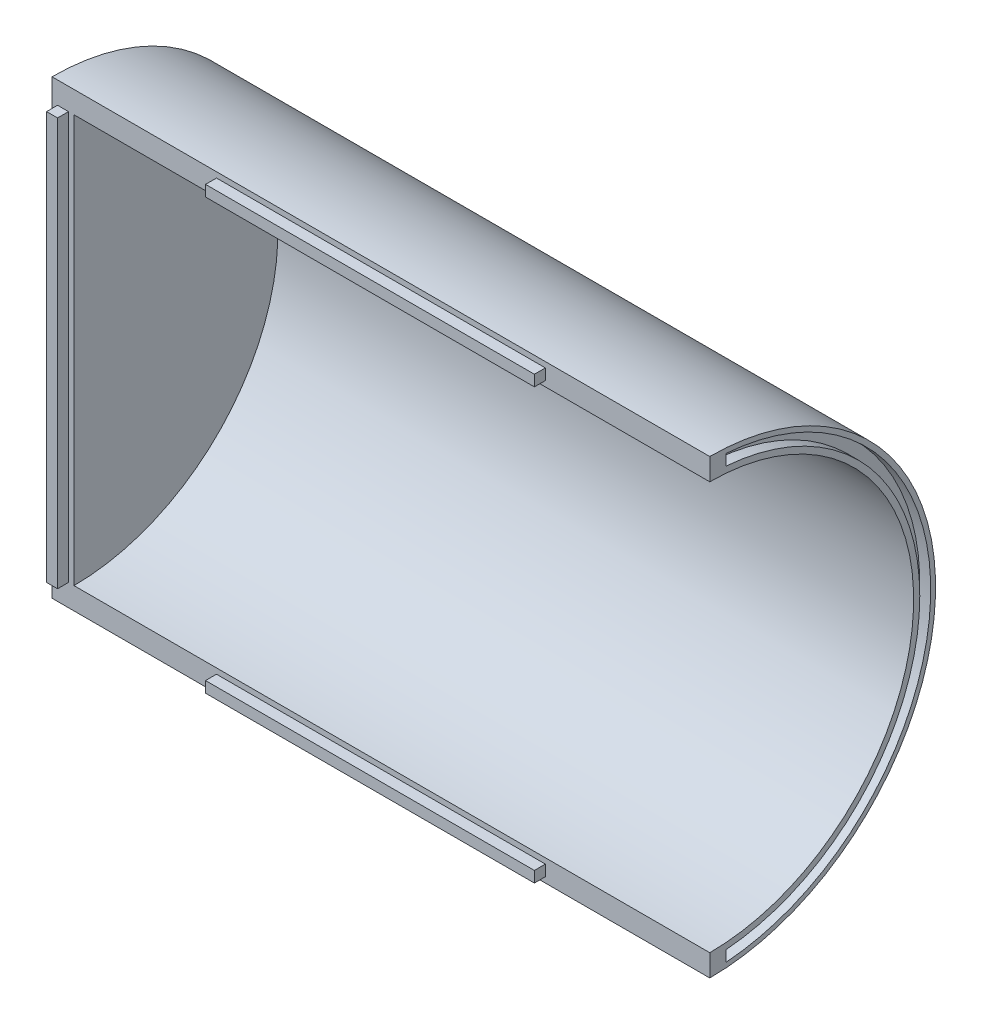
ISO-10303-21;
HEADER;
FILE_DESCRIPTION(('STEP AP214'),'2;1');
FILE_NAME('part.step','',(''),(''),'','','');
FILE_SCHEMA(('AUTOMOTIVE_DESIGN { 1 0 10303 214 1 1 1 1 }'));
ENDSEC;
DATA;
#1=APPLICATION_CONTEXT('core data for automotive mechanical design processes');
#2=APPLICATION_PROTOCOL_DEFINITION('international standard','automotive_design',2000,#1);
#3=PRODUCT_CONTEXT('',#1,'mechanical');
#4=PRODUCT('Part','Part','',(#3));
#5=PRODUCT_RELATED_PRODUCT_CATEGORY('part','',(#4));
#6=PRODUCT_DEFINITION_FORMATION('','',#4);
#7=PRODUCT_DEFINITION_CONTEXT('part definition',#1,'design');
#8=PRODUCT_DEFINITION('design','',#6,#7);
#9=PRODUCT_DEFINITION_SHAPE('','',#8);
#10=(LENGTH_UNIT() NAMED_UNIT(*) SI_UNIT(.MILLI.,.METRE.));
#11=(NAMED_UNIT(*) PLANE_ANGLE_UNIT() SI_UNIT($,.RADIAN.));
#12=(NAMED_UNIT(*) SI_UNIT($,.STERADIAN.) SOLID_ANGLE_UNIT());
#13=UNCERTAINTY_MEASURE_WITH_UNIT(LENGTH_MEASURE(1.E-05),#10,'distance_accuracy_value','');
#14=(GEOMETRIC_REPRESENTATION_CONTEXT(3) GLOBAL_UNCERTAINTY_ASSIGNED_CONTEXT((#13)) GLOBAL_UNIT_ASSIGNED_CONTEXT((#10,
#11,#12)) REPRESENTATION_CONTEXT('',''));
#15=CARTESIAN_POINT('',(0.,0.,0.));
#16=DIRECTION('',(0.,0.,1.));
#17=DIRECTION('',(1.,0.,0.));
#18=AXIS2_PLACEMENT_3D('',#15,#16,#17);
#19=CARTESIAN_POINT('',(152.4,-52.324,3.65376539147256E-13));
#20=DIRECTION('',(1.,0.,0.));
#21=DIRECTION('',(0.,1.,0.));
#22=AXIS2_PLACEMENT_3D('',#19,#20,#21);
#23=PLANE('',#22);
#24=CARTESIAN_POINT('',(152.4,0.,0.));
#25=DIRECTION('',(1.,0.,0.));
#26=DIRECTION('',(0.,1.,0.));
#27=AXIS2_PLACEMENT_3D('',#24,#25,#26);
#28=CIRCLE('',#27,47.244);
#29=CARTESIAN_POINT('',(152.4,-47.244,3.2990308874461E-13));
#30=VERTEX_POINT('',#29);
#31=CARTESIAN_POINT('',(152.4,47.244,0.));
#32=VERTEX_POINT('',#31);
#33=EDGE_CURVE('E372',#30,#32,#28,.T.);
#34=ORIENTED_EDGE('',*,*,#33,.F.);
#35=DIRECTION('',(0.,-1.,0.));
#36=VECTOR('',#35,1.);
#37=CARTESIAN_POINT('',(152.4,-52.324,3.65376539147256E-13));
#38=LINE('',#37,#36);
#39=CARTESIAN_POINT('',(152.4,-52.324,3.65376539147256E-13));
#40=VERTEX_POINT('',#39);
#41=EDGE_CURVE('E357',#30,#40,#38,.T.);
#42=ORIENTED_EDGE('',*,*,#41,.T.);
#43=CARTESIAN_POINT('',(152.4,0.,0.));
#44=DIRECTION('',(1.,0.,0.));
#45=DIRECTION('',(0.,1.,0.));
#46=AXIS2_PLACEMENT_3D('',#43,#44,#45);
#47=CIRCLE('',#46,52.324);
#48=CARTESIAN_POINT('',(152.4,52.324,0.));
#49=VERTEX_POINT('',#48);
#50=EDGE_CURVE('E48',#40,#49,#47,.T.);
#51=ORIENTED_EDGE('',*,*,#50,.T.);
#52=DIRECTION('',(0.,1.,0.));
#53=VECTOR('',#52,1.);
#54=CARTESIAN_POINT('',(152.4,52.324,0.));
#55=LINE('',#54,#53);
#56=EDGE_CURVE('E341',#32,#49,#55,.T.);
#57=ORIENTED_EDGE('',*,*,#56,.F.);
#58=EDGE_LOOP('',(#34,#42,#51,#57));
#59=FACE_BOUND('',#58,.T.);
#60=CARTESIAN_POINT('',(152.4,0.,0.));
#61=DIRECTION('',(1.,0.,0.));
#62=DIRECTION('',(0.,1.,0.));
#63=AXIS2_PLACEMENT_3D('',#60,#61,#62);
#64=CIRCLE('',#63,51.1959667942701);
#65=CARTESIAN_POINT('',(152.4,-51.054,-3.81000000000033));
#66=VERTEX_POINT('',#65);
#67=CARTESIAN_POINT('',(152.4,51.054,-3.81000000000037));
#68=VERTEX_POINT('',#67);
#69=EDGE_CURVE('E197',#66,#68,#64,.T.);
#70=ORIENTED_EDGE('',*,*,#69,.F.);
#71=DIRECTION('',(0.,1.,0.));
#72=VECTOR('',#71,1.);
#73=CARTESIAN_POINT('',(152.4,-51.054,-3.81000000000034));
#74=LINE('',#73,#72);
#75=CARTESIAN_POINT('',(152.4,-48.514,-3.81000000000034));
#76=VERTEX_POINT('',#75);
#77=EDGE_CURVE('E55',#66,#76,#74,.T.);
#78=ORIENTED_EDGE('',*,*,#77,.T.);
#79=CARTESIAN_POINT('',(152.4,0.,0.));
#80=DIRECTION('',(1.,0.,0.));
#81=DIRECTION('',(0.,1.,0.));
#82=AXIS2_PLACEMENT_3D('',#79,#80,#81);
#83=CIRCLE('',#82,48.66337735916);
#84=CARTESIAN_POINT('',(152.4,48.514,-3.81000000000034));
#85=VERTEX_POINT('',#84);
#86=EDGE_CURVE('E201',#76,#85,#83,.T.);
#87=ORIENTED_EDGE('',*,*,#86,.T.);
#88=DIRECTION('',(0.,-1.,0.));
#89=VECTOR('',#88,1.);
#90=CARTESIAN_POINT('',(152.4,51.054,-3.81000000000034));
#91=LINE('',#90,#89);
#92=EDGE_CURVE('E626',#68,#85,#91,.T.);
#93=ORIENTED_EDGE('',*,*,#92,.F.);
#94=EDGE_LOOP('',(#70,#78,#87,#93));
#95=FACE_BOUND('',#94,.T.);
#96=ADVANCED_FACE('F39',(#59,#95),#23,.T.);
#97=CARTESIAN_POINT('',(0.,0.,0.));
#98=DIRECTION('',(0.,0.,1.));
#99=DIRECTION('',(-1.,0.,0.));
#100=AXIS2_PLACEMENT_3D('',#97,#98,#99);
#101=PLANE('',#100);
#102=DIRECTION('',(1.,0.,0.));
#103=VECTOR('',#102,1.);
#104=CARTESIAN_POINT('',(38.1,51.0540000000002,0.));
#105=LINE('',#104,#103);
#106=CARTESIAN_POINT('',(38.1,51.0540000000002,0.));
#107=VERTEX_POINT('',#106);
#108=CARTESIAN_POINT('',(114.3,51.0539999999998,0.));
#109=VERTEX_POINT('',#108);
#110=EDGE_CURVE('E233',#107,#109,#105,.T.);
#111=ORIENTED_EDGE('',*,*,#110,.T.);
#112=DIRECTION('',(0.,1.,0.));
#113=VECTOR('',#112,1.);
#114=CARTESIAN_POINT('',(114.3,48.5140000000002,0.));
#115=LINE('',#114,#113);
#116=CARTESIAN_POINT('',(114.3,48.5140000000002,-3.38771451345273E-13));
#117=VERTEX_POINT('',#116);
#118=EDGE_CURVE('E230',#117,#109,#115,.T.);
#119=ORIENTED_EDGE('',*,*,#118,.F.);
#120=DIRECTION('',(1.,0.,0.));
#121=VECTOR('',#120,1.);
#122=CARTESIAN_POINT('',(38.1,48.5140000000002,0.));
#123=LINE('',#122,#121);
#124=CARTESIAN_POINT('',(38.1,48.5140000000002,0.));
#125=VERTEX_POINT('',#124);
#126=EDGE_CURVE('E226',#125,#117,#123,.T.);
#127=ORIENTED_EDGE('',*,*,#126,.F.);
#128=DIRECTION('',(0.,1.,0.));
#129=VECTOR('',#128,1.);
#130=CARTESIAN_POINT('',(38.1,48.5140000000002,0.));
#131=LINE('',#130,#129);
#132=EDGE_CURVE('E222',#125,#107,#131,.T.);
#133=ORIENTED_EDGE('',*,*,#132,.T.);
#134=EDGE_LOOP('',(#111,#119,#127,#133));
#135=FACE_BOUND('',#134,.T.);
#136=DIRECTION('',(0.,-1.,0.));
#137=VECTOR('',#136,1.);
#138=CARTESIAN_POINT('',(5.08,-47.244,3.2990308874461E-13));
#139=LINE('',#138,#137);
#140=CARTESIAN_POINT('',(5.08,47.244,0.));
#141=VERTEX_POINT('',#140);
#142=CARTESIAN_POINT('',(5.08,-47.244,3.2990308874461E-13));
#143=VERTEX_POINT('',#142);
#144=EDGE_CURVE('E349',#141,#143,#139,.T.);
#145=ORIENTED_EDGE('',*,*,#144,.F.);
#146=DIRECTION('',(1.,0.,0.));
#147=VECTOR('',#146,1.);
#148=CARTESIAN_POINT('',(152.4,47.244,0.));
#149=LINE('',#148,#147);
#150=EDGE_CURVE('E337',#141,#32,#149,.T.);
#151=ORIENTED_EDGE('',*,*,#150,.T.);
#152=ORIENTED_EDGE('',*,*,#56,.T.);
#153=DIRECTION('',(-1.,0.,0.));
#154=VECTOR('',#153,1.);
#155=CARTESIAN_POINT('',(0.,52.324,0.));
#156=LINE('',#155,#154);
#157=CARTESIAN_POINT('',(0.,52.324,0.));
#158=VERTEX_POINT('',#157);
#159=EDGE_CURVE('E345',#49,#158,#156,.T.);
#160=ORIENTED_EDGE('',*,*,#159,.T.);
#161=DIRECTION('',(0.,1.,0.));
#162=VECTOR('',#161,1.);
#163=CARTESIAN_POINT('',(0.,0.,0.));
#164=LINE('',#163,#162);
#165=CARTESIAN_POINT('',(0.,-52.324,3.65376539147256E-13));
#166=VERTEX_POINT('',#165);
#167=EDGE_CURVE('E365',#166,#158,#164,.T.);
#168=ORIENTED_EDGE('',*,*,#167,.F.);
#169=DIRECTION('',(-1.,0.,0.));
#170=VECTOR('',#169,1.);
#171=CARTESIAN_POINT('',(0.,-52.324,3.65376539147256E-13));
#172=LINE('',#171,#170);
#173=EDGE_CURVE('E361',#40,#166,#172,.T.);
#174=ORIENTED_EDGE('',*,*,#173,.F.);
#175=ORIENTED_EDGE('',*,*,#41,.F.);
#176=DIRECTION('',(1.,0.,0.));
#177=VECTOR('',#176,1.);
#178=CARTESIAN_POINT('',(152.4,-47.244,3.2990308874461E-13));
#179=LINE('',#178,#177);
#180=EDGE_CURVE('E353',#143,#30,#179,.T.);
#181=ORIENTED_EDGE('',*,*,#180,.F.);
#182=EDGE_LOOP('',(#145,#151,#152,#160,#168,#174,#175,#181));
#183=FACE_BOUND('',#182,.T.);
#184=DIRECTION('',(1.,0.,0.));
#185=VECTOR('',#184,1.);
#186=CARTESIAN_POINT('',(38.1,-51.0539999999998,0.));
#187=LINE('',#186,#185);
#188=CARTESIAN_POINT('',(38.1,-51.0539999999998,3.56508176546594E-13));
#189=VERTEX_POINT('',#188);
#190=CARTESIAN_POINT('',(114.3,-51.0539999999998,3.56508176546594E-13));
#191=VERTEX_POINT('',#190);
#192=EDGE_CURVE('E313',#189,#191,#187,.T.);
#193=ORIENTED_EDGE('',*,*,#192,.F.);
#194=DIRECTION('',(0.,-1.,0.));
#195=VECTOR('',#194,1.);
#196=CARTESIAN_POINT('',(38.1,-48.5140000000002,0.));
#197=LINE('',#196,#195);
#198=CARTESIAN_POINT('',(38.1,-48.5140000000002,0.));
#199=VERTEX_POINT('',#198);
#200=EDGE_CURVE('E280',#199,#189,#197,.T.);
#201=ORIENTED_EDGE('',*,*,#200,.F.);
#202=DIRECTION('',(1.,0.,0.));
#203=VECTOR('',#202,1.);
#204=CARTESIAN_POINT('',(38.1,-48.5140000000002,0.));
#205=LINE('',#204,#203);
#206=CARTESIAN_POINT('',(114.3,-48.5140000000002,3.38771451345273E-13));
#207=VERTEX_POINT('',#206);
#208=EDGE_CURVE('E298',#199,#207,#205,.T.);
#209=ORIENTED_EDGE('',*,*,#208,.T.);
#210=DIRECTION('',(0.,-1.,0.));
#211=VECTOR('',#210,1.);
#212=CARTESIAN_POINT('',(114.3,-48.5140000000002,0.));
#213=LINE('',#212,#211);
#214=EDGE_CURVE('E317',#207,#191,#213,.T.);
#215=ORIENTED_EDGE('',*,*,#214,.T.);
#216=EDGE_LOOP('',(#193,#201,#209,#215));
#217=FACE_BOUND('',#216,.T.);
#218=DIRECTION('',(0.,1.,0.));
#219=VECTOR('',#218,1.);
#220=CARTESIAN_POINT('',(1.26999999999995,-47.244,0.));
#221=LINE('',#220,#219);
#222=CARTESIAN_POINT('',(1.26999999999995,-47.244,0.));
#223=VERTEX_POINT('',#222);
#224=CARTESIAN_POINT('',(1.26999999999997,47.244,0.));
#225=VERTEX_POINT('',#224);
#226=EDGE_CURVE('E272',#223,#225,#221,.T.);
#227=ORIENTED_EDGE('',*,*,#226,.T.);
#228=DIRECTION('',(-1.,0.,0.));
#229=VECTOR('',#228,1.);
#230=CARTESIAN_POINT('',(3.80999999999997,47.244,0.));
#231=LINE('',#230,#229);
#232=CARTESIAN_POINT('',(3.80999999999997,47.244,0.));
#233=VERTEX_POINT('',#232);
#234=EDGE_CURVE('E276',#233,#225,#231,.T.);
#235=ORIENTED_EDGE('',*,*,#234,.F.);
#236=DIRECTION('',(0.,1.,0.));
#237=VECTOR('',#236,1.);
#238=CARTESIAN_POINT('',(3.81000000000005,-47.244,0.));
#239=LINE('',#238,#237);
#240=CARTESIAN_POINT('',(3.81000000000005,-47.244,3.2990308874461E-13));
#241=VERTEX_POINT('',#240);
#242=EDGE_CURVE('E264',#241,#233,#239,.T.);
#243=ORIENTED_EDGE('',*,*,#242,.F.);
#244=DIRECTION('',(-1.,0.,0.));
#245=VECTOR('',#244,1.);
#246=CARTESIAN_POINT('',(3.81000000000005,-47.244,0.));
#247=LINE('',#246,#245);
#248=EDGE_CURVE('E267',#241,#223,#247,.T.);
#249=ORIENTED_EDGE('',*,*,#248,.T.);
#250=EDGE_LOOP('',(#227,#235,#243,#249));
#251=FACE_BOUND('',#250,.T.);
#252=ADVANCED_FACE('F383',(#135,#183,#217,#251),#101,.T.);
#253=CARTESIAN_POINT('',(0.,0.,0.));
#254=DIRECTION('',(-1.,0.,0.));
#255=DIRECTION('',(0.,-1.,0.));
#256=AXIS2_PLACEMENT_3D('',#253,#254,#255);
#257=PLANE('',#256);
#258=CARTESIAN_POINT('',(0.,0.,0.));
#259=DIRECTION('',(1.,0.,0.));
#260=DIRECTION('',(0.,1.,0.));
#261=AXIS2_PLACEMENT_3D('',#258,#259,#260);
#262=CIRCLE('',#261,52.324);
#263=EDGE_CURVE('E11',#166,#158,#262,.T.);
#264=ORIENTED_EDGE('',*,*,#263,.F.);
#265=ORIENTED_EDGE('',*,*,#167,.T.);
#266=EDGE_LOOP('',(#264,#265));
#267=FACE_BOUND('',#266,.T.);
#268=ADVANCED_FACE('F41',(#267),#257,.T.);
#269=CARTESIAN_POINT('',(5.08,0.,0.));
#270=DIRECTION('',(1.,0.,0.));
#271=DIRECTION('',(0.,1.,0.));
#272=AXIS2_PLACEMENT_3D('',#269,#270,#271);
#273=CYLINDRICAL_SURFACE('',#272,52.324);
#274=ORIENTED_EDGE('',*,*,#50,.F.);
#275=ORIENTED_EDGE('',*,*,#173,.T.);
#276=ORIENTED_EDGE('',*,*,#263,.T.);
#277=ORIENTED_EDGE('',*,*,#159,.F.);
#278=EDGE_LOOP('',(#274,#275,#276,#277));
#279=FACE_BOUND('',#278,.T.);
#280=ADVANCED_FACE('F387',(#279),#273,.T.);
#281=CARTESIAN_POINT('',(5.08,0.,0.));
#282=DIRECTION('',(1.,0.,0.));
#283=DIRECTION('',(0.,1.,0.));
#284=AXIS2_PLACEMENT_3D('',#281,#282,#283);
#285=CYLINDRICAL_SURFACE('',#284,47.244);
#286=CARTESIAN_POINT('',(5.08,0.,0.));
#287=DIRECTION('',(1.,0.,0.));
#288=DIRECTION('',(0.,1.,0.));
#289=AXIS2_PLACEMENT_3D('',#286,#287,#288);
#290=CIRCLE('',#289,47.244);
#291=EDGE_CURVE('E368',#143,#141,#290,.T.);
#292=ORIENTED_EDGE('',*,*,#291,.F.);
#293=ORIENTED_EDGE('',*,*,#180,.T.);
#294=ORIENTED_EDGE('',*,*,#33,.T.);
#295=ORIENTED_EDGE('',*,*,#150,.F.);
#296=EDGE_LOOP('',(#292,#293,#294,#295));
#297=FACE_BOUND('',#296,.T.);
#298=ADVANCED_FACE('F391',(#297),#285,.F.);
#299=CARTESIAN_POINT('',(5.08,-47.244,3.2990308874461E-13));
#300=DIRECTION('',(1.,0.,0.));
#301=DIRECTION('',(0.,1.,0.));
#302=AXIS2_PLACEMENT_3D('',#299,#300,#301);
#303=PLANE('',#302);
#304=ORIENTED_EDGE('',*,*,#144,.T.);
#305=ORIENTED_EDGE('',*,*,#291,.T.);
#306=EDGE_LOOP('',(#304,#305));
#307=FACE_BOUND('',#306,.T.);
#308=ADVANCED_FACE('F393',(#307),#303,.T.);
#309=CARTESIAN_POINT('',(38.1,-48.5140000000002,2.54));
#310=DIRECTION('',(1.,0.,0.));
#311=DIRECTION('',(0.,1.,0.));
#312=AXIS2_PLACEMENT_3D('',#309,#310,#311);
#313=PLANE('',#312);
#314=ORIENTED_EDGE('',*,*,#200,.T.);
#315=DIRECTION('',(0.,0.,-1.));
#316=VECTOR('',#315,1.);
#317=CARTESIAN_POINT('',(38.1,-51.0539999999998,2.54));
#318=LINE('',#317,#316);
#319=CARTESIAN_POINT('',(38.1,-51.0539999999998,2.54));
#320=VERTEX_POINT('',#319);
#321=EDGE_CURVE('E333',#320,#189,#318,.T.);
#322=ORIENTED_EDGE('',*,*,#321,.F.);
#323=DIRECTION('',(0.,-1.,0.));
#324=VECTOR('',#323,1.);
#325=CARTESIAN_POINT('',(38.1,-48.5140000000002,2.54));
#326=LINE('',#325,#324);
#327=CARTESIAN_POINT('',(38.1,-48.5140000000002,2.54));
#328=VERTEX_POINT('',#327);
#329=EDGE_CURVE('E293',#328,#320,#326,.T.);
#330=ORIENTED_EDGE('',*,*,#329,.F.);
#331=DIRECTION('',(0.,0.,-1.));
#332=VECTOR('',#331,1.);
#333=CARTESIAN_POINT('',(38.1,-48.5140000000002,2.54));
#334=LINE('',#333,#332);
#335=EDGE_CURVE('E309',#328,#199,#334,.T.);
#336=ORIENTED_EDGE('',*,*,#335,.T.);
#337=EDGE_LOOP('',(#314,#322,#330,#336));
#338=FACE_BOUND('',#337,.T.);
#339=ADVANCED_FACE('F395',(#338),#313,.F.);
#340=CARTESIAN_POINT('',(38.1,-51.0539999999998,2.54));
#341=DIRECTION('',(0.,1.,0.));
#342=DIRECTION('',(0.,0.,1.));
#343=AXIS2_PLACEMENT_3D('',#340,#341,#342);
#344=PLANE('',#343);
#345=ORIENTED_EDGE('',*,*,#192,.T.);
#346=DIRECTION('',(0.,0.,-1.));
#347=VECTOR('',#346,1.);
#348=CARTESIAN_POINT('',(114.3,-51.0539999999998,2.54));
#349=LINE('',#348,#347);
#350=CARTESIAN_POINT('',(114.3,-51.0539999999998,2.54));
#351=VERTEX_POINT('',#350);
#352=EDGE_CURVE('E329',#351,#191,#349,.T.);
#353=ORIENTED_EDGE('',*,*,#352,.F.);
#354=DIRECTION('',(1.,0.,0.));
#355=VECTOR('',#354,1.);
#356=CARTESIAN_POINT('',(38.1,-51.0539999999998,2.54));
#357=LINE('',#356,#355);
#358=EDGE_CURVE('E297',#320,#351,#357,.T.);
#359=ORIENTED_EDGE('',*,*,#358,.F.);
#360=ORIENTED_EDGE('',*,*,#321,.T.);
#361=EDGE_LOOP('',(#345,#353,#359,#360));
#362=FACE_BOUND('',#361,.T.);
#363=ADVANCED_FACE('F401',(#362),#344,.F.);
#364=CARTESIAN_POINT('',(114.3,-48.5140000000002,2.54));
#365=DIRECTION('',(1.,0.,0.));
#366=DIRECTION('',(0.,1.,0.));
#367=AXIS2_PLACEMENT_3D('',#364,#365,#366);
#368=PLANE('',#367);
#369=ORIENTED_EDGE('',*,*,#214,.F.);
#370=DIRECTION('',(0.,0.,-1.));
#371=VECTOR('',#370,1.);
#372=CARTESIAN_POINT('',(114.3,-48.5140000000002,2.54));
#373=LINE('',#372,#371);
#374=CARTESIAN_POINT('',(114.3,-48.5140000000002,2.54));
#375=VERTEX_POINT('',#374);
#376=EDGE_CURVE('E325',#375,#207,#373,.T.);
#377=ORIENTED_EDGE('',*,*,#376,.F.);
#378=DIRECTION('',(0.,-1.,0.));
#379=VECTOR('',#378,1.);
#380=CARTESIAN_POINT('',(114.3,-48.5140000000002,2.54));
#381=LINE('',#380,#379);
#382=EDGE_CURVE('E301',#375,#351,#381,.T.);
#383=ORIENTED_EDGE('',*,*,#382,.T.);
#384=ORIENTED_EDGE('',*,*,#352,.T.);
#385=EDGE_LOOP('',(#369,#377,#383,#384));
#386=FACE_BOUND('',#385,.T.);
#387=ADVANCED_FACE('F441',(#386),#368,.T.);
#388=CARTESIAN_POINT('',(38.1,-48.5140000000002,2.54));
#389=DIRECTION('',(0.,1.,0.));
#390=DIRECTION('',(0.,0.,1.));
#391=AXIS2_PLACEMENT_3D('',#388,#389,#390);
#392=PLANE('',#391);
#393=ORIENTED_EDGE('',*,*,#208,.F.);
#394=ORIENTED_EDGE('',*,*,#335,.F.);
#395=DIRECTION('',(1.,0.,0.));
#396=VECTOR('',#395,1.);
#397=CARTESIAN_POINT('',(38.1,-48.5140000000002,2.54));
#398=LINE('',#397,#396);
#399=EDGE_CURVE('E305',#328,#375,#398,.T.);
#400=ORIENTED_EDGE('',*,*,#399,.T.);
#401=ORIENTED_EDGE('',*,*,#376,.T.);
#402=EDGE_LOOP('',(#393,#394,#400,#401));
#403=FACE_BOUND('',#402,.T.);
#404=ADVANCED_FACE('F451',(#403),#392,.T.);
#405=CARTESIAN_POINT('',(0.,0.,2.54));
#406=DIRECTION('',(0.,0.,1.));
#407=DIRECTION('',(1.,0.,0.));
#408=AXIS2_PLACEMENT_3D('',#405,#406,#407);
#409=PLANE('',#408);
#410=ORIENTED_EDGE('',*,*,#329,.T.);
#411=ORIENTED_EDGE('',*,*,#358,.T.);
#412=ORIENTED_EDGE('',*,*,#382,.F.);
#413=ORIENTED_EDGE('',*,*,#399,.F.);
#414=EDGE_LOOP('',(#410,#411,#412,#413));
#415=FACE_BOUND('',#414,.T.);
#416=ADVANCED_FACE('F461',(#415),#409,.T.);
#417=CARTESIAN_POINT('',(3.80999999999997,47.244,2.54));
#418=DIRECTION('',(0.,-1.,0.));
#419=DIRECTION('',(0.,0.,-1.));
#420=AXIS2_PLACEMENT_3D('',#417,#418,#419);
#421=PLANE('',#420);
#422=ORIENTED_EDGE('',*,*,#234,.T.);
#423=DIRECTION('',(0.,0.,-1.));
#424=VECTOR('',#423,1.);
#425=CARTESIAN_POINT('',(1.26999999999997,47.244,2.54));
#426=LINE('',#425,#424);
#427=CARTESIAN_POINT('',(1.26999999999997,47.244,2.54));
#428=VERTEX_POINT('',#427);
#429=EDGE_CURVE('E237',#428,#225,#426,.T.);
#430=ORIENTED_EDGE('',*,*,#429,.F.);
#431=DIRECTION('',(-1.,0.,0.));
#432=VECTOR('',#431,1.);
#433=CARTESIAN_POINT('',(3.80999999999997,47.244,2.54));
#434=LINE('',#433,#432);
#435=CARTESIAN_POINT('',(3.80999999999997,47.244,2.54));
#436=VERTEX_POINT('',#435);
#437=EDGE_CURVE('E268',#436,#428,#434,.T.);
#438=ORIENTED_EDGE('',*,*,#437,.F.);
#439=DIRECTION('',(0.,0.,-1.));
#440=VECTOR('',#439,1.);
#441=CARTESIAN_POINT('',(3.80999999999997,47.244,2.54));
#442=LINE('',#441,#440);
#443=EDGE_CURVE('E259',#436,#233,#442,.T.);
#444=ORIENTED_EDGE('',*,*,#443,.T.);
#445=EDGE_LOOP('',(#422,#430,#438,#444));
#446=FACE_BOUND('',#445,.T.);
#447=ADVANCED_FACE('F471',(#446),#421,.F.);
#448=CARTESIAN_POINT('',(1.26999999999995,-47.244,2.54));
#449=DIRECTION('',(-1.,0.,0.));
#450=DIRECTION('',(0.,-1.,0.));
#451=AXIS2_PLACEMENT_3D('',#448,#449,#450);
#452=PLANE('',#451);
#453=ORIENTED_EDGE('',*,*,#226,.F.);
#454=DIRECTION('',(0.,0.,-1.));
#455=VECTOR('',#454,1.);
#456=CARTESIAN_POINT('',(1.26999999999995,-47.244,2.54));
#457=LINE('',#456,#455);
#458=CARTESIAN_POINT('',(1.26999999999995,-47.244,2.54));
#459=VERTEX_POINT('',#458);
#460=EDGE_CURVE('E252',#459,#223,#457,.T.);
#461=ORIENTED_EDGE('',*,*,#460,.F.);
#462=DIRECTION('',(0.,1.,0.));
#463=VECTOR('',#462,1.);
#464=CARTESIAN_POINT('',(1.26999999999995,-47.244,2.54));
#465=LINE('',#464,#463);
#466=EDGE_CURVE('E287',#459,#428,#465,.T.);
#467=ORIENTED_EDGE('',*,*,#466,.T.);
#468=ORIENTED_EDGE('',*,*,#429,.T.);
#469=EDGE_LOOP('',(#453,#461,#467,#468));
#470=FACE_BOUND('',#469,.T.);
#471=ADVANCED_FACE('F481',(#470),#452,.T.);
#472=CARTESIAN_POINT('',(3.81000000000005,-47.244,2.54));
#473=DIRECTION('',(0.,-1.,0.));
#474=DIRECTION('',(0.,0.,-1.));
#475=AXIS2_PLACEMENT_3D('',#472,#473,#474);
#476=PLANE('',#475);
#477=ORIENTED_EDGE('',*,*,#248,.F.);
#478=DIRECTION('',(0.,0.,-1.));
#479=VECTOR('',#478,1.);
#480=CARTESIAN_POINT('',(3.81000000000005,-47.244,2.54));
#481=LINE('',#480,#479);
#482=CARTESIAN_POINT('',(3.81000000000005,-47.244,2.54));
#483=VERTEX_POINT('',#482);
#484=EDGE_CURVE('E255',#483,#241,#481,.T.);
#485=ORIENTED_EDGE('',*,*,#484,.F.);
#486=DIRECTION('',(-1.,0.,0.));
#487=VECTOR('',#486,1.);
#488=CARTESIAN_POINT('',(3.81000000000005,-47.244,2.54));
#489=LINE('',#488,#487);
#490=EDGE_CURVE('E283',#483,#459,#489,.T.);
#491=ORIENTED_EDGE('',*,*,#490,.T.);
#492=ORIENTED_EDGE('',*,*,#460,.T.);
#493=EDGE_LOOP('',(#477,#485,#491,#492));
#494=FACE_BOUND('',#493,.T.);
#495=ADVANCED_FACE('F491',(#494),#476,.T.);
#496=CARTESIAN_POINT('',(3.81000000000005,-47.244,2.54));
#497=DIRECTION('',(-1.,0.,0.));
#498=DIRECTION('',(0.,-1.,0.));
#499=AXIS2_PLACEMENT_3D('',#496,#497,#498);
#500=PLANE('',#499);
#501=ORIENTED_EDGE('',*,*,#242,.T.);
#502=ORIENTED_EDGE('',*,*,#443,.F.);
#503=DIRECTION('',(0.,1.,0.));
#504=VECTOR('',#503,1.);
#505=CARTESIAN_POINT('',(3.81000000000005,-47.244,2.54));
#506=LINE('',#505,#504);
#507=EDGE_CURVE('E263',#483,#436,#506,.T.);
#508=ORIENTED_EDGE('',*,*,#507,.F.);
#509=ORIENTED_EDGE('',*,*,#484,.T.);
#510=EDGE_LOOP('',(#501,#502,#508,#509));
#511=FACE_BOUND('',#510,.T.);
#512=ADVANCED_FACE('F501',(#511),#500,.F.);
#513=CARTESIAN_POINT('',(0.,0.,2.54));
#514=DIRECTION('',(0.,0.,-1.));
#515=DIRECTION('',(-1.,0.,0.));
#516=AXIS2_PLACEMENT_3D('',#513,#514,#515);
#517=PLANE('',#516);
#518=ORIENTED_EDGE('',*,*,#437,.T.);
#519=ORIENTED_EDGE('',*,*,#466,.F.);
#520=ORIENTED_EDGE('',*,*,#490,.F.);
#521=ORIENTED_EDGE('',*,*,#507,.T.);
#522=EDGE_LOOP('',(#518,#519,#520,#521));
#523=FACE_BOUND('',#522,.T.);
#524=ADVANCED_FACE('F511',(#523),#517,.F.);
#525=CARTESIAN_POINT('',(38.1,51.0540000000002,2.54));
#526=DIRECTION('',(0.,1.,0.));
#527=DIRECTION('',(-1.,0.,0.));
#528=AXIS2_PLACEMENT_3D('',#525,#526,#527);
#529=PLANE('',#528);
#530=ORIENTED_EDGE('',*,*,#110,.F.);
#531=DIRECTION('',(0.,0.,-1.));
#532=VECTOR('',#531,1.);
#533=CARTESIAN_POINT('',(38.1,51.0540000000002,2.54));
#534=LINE('',#533,#532);
#535=CARTESIAN_POINT('',(38.1,51.0540000000002,2.54));
#536=VERTEX_POINT('',#535);
#537=EDGE_CURVE('E203',#536,#107,#534,.T.);
#538=ORIENTED_EDGE('',*,*,#537,.F.);
#539=DIRECTION('',(1.,0.,0.));
#540=VECTOR('',#539,1.);
#541=CARTESIAN_POINT('',(38.1,51.0540000000002,2.54));
#542=LINE('',#541,#540);
#543=CARTESIAN_POINT('',(114.3,51.0539999999998,2.54));
#544=VERTEX_POINT('',#543);
#545=EDGE_CURVE('E227',#536,#544,#542,.T.);
#546=ORIENTED_EDGE('',*,*,#545,.T.);
#547=DIRECTION('',(0.,0.,-1.));
#548=VECTOR('',#547,1.);
#549=CARTESIAN_POINT('',(114.3,51.0539999999998,2.54));
#550=LINE('',#549,#548);
#551=EDGE_CURVE('E214',#544,#109,#550,.T.);
#552=ORIENTED_EDGE('',*,*,#551,.T.);
#553=EDGE_LOOP('',(#530,#538,#546,#552));
#554=FACE_BOUND('',#553,.T.);
#555=ADVANCED_FACE('F521',(#554),#529,.T.);
#556=CARTESIAN_POINT('',(38.1,48.5140000000002,2.54));
#557=DIRECTION('',(-1.,0.,0.));
#558=DIRECTION('',(0.,0.,1.));
#559=AXIS2_PLACEMENT_3D('',#556,#557,#558);
#560=PLANE('',#559);
#561=ORIENTED_EDGE('',*,*,#132,.F.);
#562=DIRECTION('',(0.,0.,-1.));
#563=VECTOR('',#562,1.);
#564=CARTESIAN_POINT('',(38.1,48.5140000000002,2.54));
#565=LINE('',#564,#563);
#566=CARTESIAN_POINT('',(38.1,48.5140000000002,2.54));
#567=VERTEX_POINT('',#566);
#568=EDGE_CURVE('E208',#567,#125,#565,.T.);
#569=ORIENTED_EDGE('',*,*,#568,.F.);
#570=DIRECTION('',(0.,1.,0.));
#571=VECTOR('',#570,1.);
#572=CARTESIAN_POINT('',(38.1,48.5140000000002,2.54));
#573=LINE('',#572,#571);
#574=EDGE_CURVE('E217',#567,#536,#573,.T.);
#575=ORIENTED_EDGE('',*,*,#574,.T.);
#576=ORIENTED_EDGE('',*,*,#537,.T.);
#577=EDGE_LOOP('',(#561,#569,#575,#576));
#578=FACE_BOUND('',#577,.T.);
#579=ADVANCED_FACE('F531',(#578),#560,.T.);
#580=CARTESIAN_POINT('',(38.1,48.5140000000002,2.54));
#581=DIRECTION('',(0.,1.,0.));
#582=DIRECTION('',(-1.,0.,0.));
#583=AXIS2_PLACEMENT_3D('',#580,#581,#582);
#584=PLANE('',#583);
#585=ORIENTED_EDGE('',*,*,#126,.T.);
#586=DIRECTION('',(0.,0.,-1.));
#587=VECTOR('',#586,1.);
#588=CARTESIAN_POINT('',(114.3,48.5140000000002,2.54));
#589=LINE('',#588,#587);
#590=CARTESIAN_POINT('',(114.3,48.5140000000002,2.54));
#591=VERTEX_POINT('',#590);
#592=EDGE_CURVE('E63',#591,#117,#589,.T.);
#593=ORIENTED_EDGE('',*,*,#592,.F.);
#594=DIRECTION('',(1.,0.,0.));
#595=VECTOR('',#594,1.);
#596=CARTESIAN_POINT('',(38.1,48.5140000000002,2.54));
#597=LINE('',#596,#595);
#598=EDGE_CURVE('E241',#567,#591,#597,.T.);
#599=ORIENTED_EDGE('',*,*,#598,.F.);
#600=ORIENTED_EDGE('',*,*,#568,.T.);
#601=EDGE_LOOP('',(#585,#593,#599,#600));
#602=FACE_BOUND('',#601,.T.);
#603=ADVANCED_FACE('F541',(#602),#584,.F.);
#604=CARTESIAN_POINT('',(114.3,48.5140000000002,2.54));
#605=DIRECTION('',(-1.,0.,0.));
#606=DIRECTION('',(0.,-1.,0.));
#607=AXIS2_PLACEMENT_3D('',#604,#605,#606);
#608=PLANE('',#607);
#609=ORIENTED_EDGE('',*,*,#118,.T.);
#610=ORIENTED_EDGE('',*,*,#551,.F.);
#611=DIRECTION('',(0.,1.,0.));
#612=VECTOR('',#611,1.);
#613=CARTESIAN_POINT('',(114.3,48.5140000000002,2.54));
#614=LINE('',#613,#612);
#615=EDGE_CURVE('E244',#591,#544,#614,.T.);
#616=ORIENTED_EDGE('',*,*,#615,.F.);
#617=ORIENTED_EDGE('',*,*,#592,.T.);
#618=EDGE_LOOP('',(#609,#610,#616,#617));
#619=FACE_BOUND('',#618,.T.);
#620=ADVANCED_FACE('F551',(#619),#608,.F.);
#621=CARTESIAN_POINT('',(0.,0.,2.54));
#622=DIRECTION('',(0.,0.,1.));
#623=DIRECTION('',(1.,0.,0.));
#624=AXIS2_PLACEMENT_3D('',#621,#622,#623);
#625=PLANE('',#624);
#626=ORIENTED_EDGE('',*,*,#545,.F.);
#627=ORIENTED_EDGE('',*,*,#574,.F.);
#628=ORIENTED_EDGE('',*,*,#598,.T.);
#629=ORIENTED_EDGE('',*,*,#615,.T.);
#630=EDGE_LOOP('',(#626,#627,#628,#629));
#631=FACE_BOUND('',#630,.T.);
#632=ADVANCED_FACE('F561',(#631),#625,.T.);
#633=CARTESIAN_POINT('',(149.86,-51.054,-3.81000000000034));
#634=DIRECTION('',(0.,0.,-1.));
#635=DIRECTION('',(-1.,0.,0.));
#636=AXIS2_PLACEMENT_3D('',#633,#634,#635);
#637=PLANE('',#636);
#638=ORIENTED_EDGE('',*,*,#77,.F.);
#639=DIRECTION('',(1.,0.,0.));
#640=VECTOR('',#639,1.);
#641=CARTESIAN_POINT('',(149.86,-51.054,-3.81000000000033));
#642=LINE('',#641,#640);
#643=CARTESIAN_POINT('',(149.86,-51.054,-3.81000000000033));
#644=VERTEX_POINT('',#643);
#645=EDGE_CURVE('E195',#644,#66,#642,.T.);
#646=ORIENTED_EDGE('',*,*,#645,.F.);
#647=DIRECTION('',(0.,1.,0.));
#648=VECTOR('',#647,1.);
#649=CARTESIAN_POINT('',(149.86,-51.054,-3.81000000000034));
#650=LINE('',#649,#648);
#651=CARTESIAN_POINT('',(149.86,-48.514,-3.81000000000034));
#652=VERTEX_POINT('',#651);
#653=EDGE_CURVE('E184',#644,#652,#650,.T.);
#654=ORIENTED_EDGE('',*,*,#653,.T.);
#655=DIRECTION('',(1.,0.,0.));
#656=VECTOR('',#655,1.);
#657=CARTESIAN_POINT('',(149.86,-48.514,-3.81000000000034));
#658=LINE('',#657,#656);
#659=EDGE_CURVE('E194',#652,#76,#658,.T.);
#660=ORIENTED_EDGE('',*,*,#659,.T.);
#661=EDGE_LOOP('',(#638,#646,#654,#660));
#662=FACE_BOUND('',#661,.T.);
#663=ADVANCED_FACE('F193',(#662),#637,.T.);
#664=CARTESIAN_POINT('',(149.86,0.,0.));
#665=DIRECTION('',(1.,0.,0.));
#666=DIRECTION('',(0.,1.,0.));
#667=AXIS2_PLACEMENT_3D('',#664,#665,#666);
#668=CYLINDRICAL_SURFACE('',#667,48.66337735916);
#669=ORIENTED_EDGE('',*,*,#86,.F.);
#670=ORIENTED_EDGE('',*,*,#659,.F.);
#671=CARTESIAN_POINT('',(149.86,0.,0.));
#672=DIRECTION('',(1.,0.,0.));
#673=DIRECTION('',(0.,1.,0.));
#674=AXIS2_PLACEMENT_3D('',#671,#672,#673);
#675=CIRCLE('',#674,48.66337735916);
#676=CARTESIAN_POINT('',(149.86,48.514,-3.81000000000034));
#677=VERTEX_POINT('',#676);
#678=EDGE_CURVE('E180',#652,#677,#675,.T.);
#679=ORIENTED_EDGE('',*,*,#678,.T.);
#680=DIRECTION('',(1.,0.,0.));
#681=VECTOR('',#680,1.);
#682=CARTESIAN_POINT('',(149.86,48.514,-3.81000000000034));
#683=LINE('',#682,#681);
#684=EDGE_CURVE('E204',#677,#85,#683,.T.);
#685=ORIENTED_EDGE('',*,*,#684,.T.);
#686=EDGE_LOOP('',(#669,#670,#679,#685));
#687=FACE_BOUND('',#686,.T.);
#688=ADVANCED_FACE('F199',(#687),#668,.T.);
#689=CARTESIAN_POINT('',(149.86,51.054,-3.81000000000034));
#690=DIRECTION('',(0.,0.,1.));
#691=DIRECTION('',(1.,0.,0.));
#692=AXIS2_PLACEMENT_3D('',#689,#690,#691);
#693=PLANE('',#692);
#694=ORIENTED_EDGE('',*,*,#92,.T.);
#695=ORIENTED_EDGE('',*,*,#684,.F.);
#696=DIRECTION('',(0.,-1.,0.));
#697=VECTOR('',#696,1.);
#698=CARTESIAN_POINT('',(149.86,51.054,-3.81000000000034));
#699=LINE('',#698,#697);
#700=CARTESIAN_POINT('',(149.86,51.054,-3.81000000000037));
#701=VERTEX_POINT('',#700);
#702=EDGE_CURVE('E187',#701,#677,#699,.T.);
#703=ORIENTED_EDGE('',*,*,#702,.F.);
#704=DIRECTION('',(1.,0.,0.));
#705=VECTOR('',#704,1.);
#706=CARTESIAN_POINT('',(149.86,51.054,-3.81000000000037));
#707=LINE('',#706,#705);
#708=EDGE_CURVE('E210',#701,#68,#707,.T.);
#709=ORIENTED_EDGE('',*,*,#708,.T.);
#710=EDGE_LOOP('',(#694,#695,#703,#709));
#711=FACE_BOUND('',#710,.T.);
#712=ADVANCED_FACE('F591',(#711),#693,.F.);
#713=CARTESIAN_POINT('',(149.86,0.,0.));
#714=DIRECTION('',(1.,0.,0.));
#715=DIRECTION('',(0.,1.,0.));
#716=AXIS2_PLACEMENT_3D('',#713,#714,#715);
#717=CYLINDRICAL_SURFACE('',#716,51.1959667942701);
#718=ORIENTED_EDGE('',*,*,#69,.T.);
#719=ORIENTED_EDGE('',*,*,#708,.F.);
#720=CARTESIAN_POINT('',(149.86,0.,0.));
#721=DIRECTION('',(1.,0.,0.));
#722=DIRECTION('',(0.,1.,0.));
#723=AXIS2_PLACEMENT_3D('',#720,#721,#722);
#724=CIRCLE('',#723,51.1959667942701);
#725=EDGE_CURVE('E636',#644,#701,#724,.T.);
#726=ORIENTED_EDGE('',*,*,#725,.F.);
#727=ORIENTED_EDGE('',*,*,#645,.T.);
#728=EDGE_LOOP('',(#718,#719,#726,#727));
#729=FACE_BOUND('',#728,.T.);
#730=ADVANCED_FACE('F600',(#729),#717,.F.);
#731=CARTESIAN_POINT('',(149.86,0.,0.));
#732=DIRECTION('',(1.,0.,0.));
#733=DIRECTION('',(0.,1.,0.));
#734=AXIS2_PLACEMENT_3D('',#731,#732,#733);
#735=PLANE('',#734);
#736=ORIENTED_EDGE('',*,*,#653,.F.);
#737=ORIENTED_EDGE('',*,*,#725,.T.);
#738=ORIENTED_EDGE('',*,*,#702,.T.);
#739=ORIENTED_EDGE('',*,*,#678,.F.);
#740=EDGE_LOOP('',(#736,#737,#738,#739));
#741=FACE_BOUND('',#740,.T.);
#742=ADVANCED_FACE('F182',(#741),#735,.T.);
#743=CLOSED_SHELL('',(#96,#252,#268,#280,#298,#308,#339,#363,#387,#404,#416,#447,#471,#495,#512,
#524,#555,#579,#603,#620,#632,#663,#688,#712,#730,#742));
#744=MANIFOLD_SOLID_BREP('B2',#743);
#745=ADVANCED_BREP_SHAPE_REPRESENTATION('',(#18,#744),#14);
#746=SHAPE_DEFINITION_REPRESENTATION(#9,#745);
ENDSEC;
END-ISO-10303-21;
